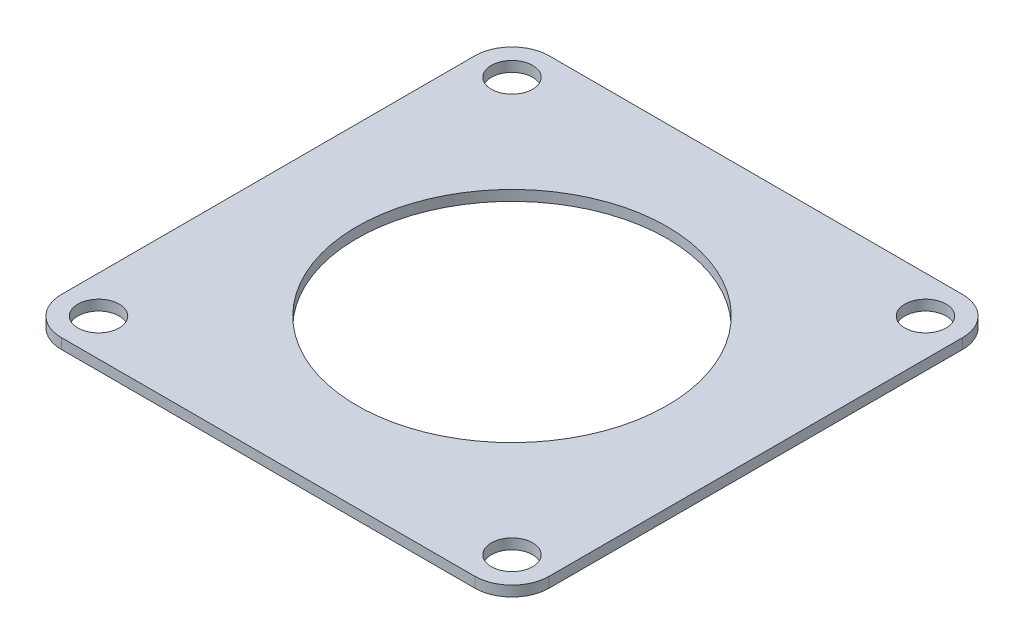
ISO-10303-21;
HEADER;
FILE_DESCRIPTION(('STEP AP214'),'2;1');
FILE_NAME('part.step','',(''),(''),'','','');
FILE_SCHEMA(('AUTOMOTIVE_DESIGN { 1 0 10303 214 1 1 1 1 }'));
ENDSEC;
DATA;
#1=APPLICATION_CONTEXT('core data for automotive mechanical design processes');
#2=APPLICATION_PROTOCOL_DEFINITION('international standard','automotive_design',2000,#1);
#3=PRODUCT_CONTEXT('',#1,'mechanical');
#4=PRODUCT('Part','Part','',(#3));
#5=PRODUCT_RELATED_PRODUCT_CATEGORY('part','',(#4));
#6=PRODUCT_DEFINITION_FORMATION('','',#4);
#7=PRODUCT_DEFINITION_CONTEXT('part definition',#1,'design');
#8=PRODUCT_DEFINITION('design','',#6,#7);
#9=PRODUCT_DEFINITION_SHAPE('','',#8);
#10=(LENGTH_UNIT() NAMED_UNIT(*) SI_UNIT(.MILLI.,.METRE.));
#11=(NAMED_UNIT(*) PLANE_ANGLE_UNIT() SI_UNIT($,.RADIAN.));
#12=(NAMED_UNIT(*) SI_UNIT($,.STERADIAN.) SOLID_ANGLE_UNIT());
#13=UNCERTAINTY_MEASURE_WITH_UNIT(LENGTH_MEASURE(1.E-05),#10,'distance_accuracy_value','');
#14=(GEOMETRIC_REPRESENTATION_CONTEXT(3) GLOBAL_UNCERTAINTY_ASSIGNED_CONTEXT((#13)) GLOBAL_UNIT_ASSIGNED_CONTEXT((#10,
#11,#12)) REPRESENTATION_CONTEXT('',''));
#15=CARTESIAN_POINT('',(0.,0.,0.));
#16=DIRECTION('',(0.,0.,1.));
#17=DIRECTION('',(1.,0.,0.));
#18=AXIS2_PLACEMENT_3D('',#15,#16,#17);
#19=CARTESIAN_POINT('',(-99.9999999999941,5.,-99.9999999999964));
#20=DIRECTION('',(0.,1.,0.));
#21=DIRECTION('',(0.,0.,1.));
#22=AXIS2_PLACEMENT_3D('',#19,#20,#21);
#23=PLANE('',#22);
#24=CARTESIAN_POINT('',(0.,5.,0.));
#25=DIRECTION('',(0.,-1.,0.));
#26=DIRECTION('',(0.,0.,-1.));
#27=AXIS2_PLACEMENT_3D('',#24,#25,#26);
#28=CIRCLE('',#27,75.);
#29=CARTESIAN_POINT('',(0.,5.,-75.));
#30=VERTEX_POINT('',#29);
#31=EDGE_CURVE('E200',#30,#30,#28,.T.);
#32=ORIENTED_EDGE('',*,*,#31,.T.);
#33=EDGE_LOOP('',(#32));
#34=FACE_BOUND('',#33,.T.);
#35=CARTESIAN_POINT('',(-99.9999999999905,5.,99.9999999999976));
#36=DIRECTION('',(0.,1.,0.));
#37=DIRECTION('',(0.,0.,1.));
#38=AXIS2_PLACEMENT_3D('',#35,#36,#37);
#39=CIRCLE('',#38,10.0000000000102);
#40=CARTESIAN_POINT('',(-99.9999999999905,5.,110.000000000008));
#41=VERTEX_POINT('',#40);
#42=EDGE_CURVE('E188',#41,#41,#39,.T.);
#43=ORIENTED_EDGE('',*,*,#42,.F.);
#44=EDGE_LOOP('',(#43));
#45=FACE_BOUND('',#44,.T.);
#46=CARTESIAN_POINT('',(100.,5.,-100.));
#47=DIRECTION('',(0.,1.,0.));
#48=DIRECTION('',(0.,0.,1.));
#49=AXIS2_PLACEMENT_3D('',#46,#47,#48);
#50=CIRCLE('',#49,9.99999999999999);
#51=CARTESIAN_POINT('',(100.,5.,-90.));
#52=VERTEX_POINT('',#51);
#53=EDGE_CURVE('E134',#52,#52,#50,.T.);
#54=ORIENTED_EDGE('',*,*,#53,.F.);
#55=EDGE_LOOP('',(#54));
#56=FACE_BOUND('',#55,.T.);
#57=CARTESIAN_POINT('',(-99.9999999999941,5.,-99.9999999999964));
#58=DIRECTION('',(0.,1.,0.));
#59=DIRECTION('',(0.,0.,1.));
#60=AXIS2_PLACEMENT_3D('',#57,#58,#59);
#61=CIRCLE('',#60,18.);
#62=CARTESIAN_POINT('',(-99.9999999999941,5.,-117.999999999996));
#63=VERTEX_POINT('',#62);
#64=CARTESIAN_POINT('',(-117.999999999994,5.,-99.9999999999964));
#65=VERTEX_POINT('',#64);
#66=EDGE_CURVE('E145',#63,#65,#61,.T.);
#67=ORIENTED_EDGE('',*,*,#66,.T.);
#68=DIRECTION('',(0.,0.,1.));
#69=VECTOR('',#68,1.);
#70=CARTESIAN_POINT('',(-117.999999999994,5.,99.9999999999983));
#71=LINE('',#70,#69);
#72=CARTESIAN_POINT('',(-117.999999999994,5.,99.9999999999983));
#73=VERTEX_POINT('',#72);
#74=EDGE_CURVE('E93',#65,#73,#71,.T.);
#75=ORIENTED_EDGE('',*,*,#74,.T.);
#76=CARTESIAN_POINT('',(-99.999999999994,5.,99.9999999999983));
#77=DIRECTION('',(0.,1.,0.));
#78=DIRECTION('',(0.,0.,1.));
#79=AXIS2_PLACEMENT_3D('',#76,#77,#78);
#80=CIRCLE('',#79,18.);
#81=CARTESIAN_POINT('',(-99.9999999999941,5.,117.999999999998));
#82=VERTEX_POINT('',#81);
#83=EDGE_CURVE('E160',#73,#82,#80,.T.);
#84=ORIENTED_EDGE('',*,*,#83,.T.);
#85=DIRECTION('',(1.,0.,0.));
#86=VECTOR('',#85,1.);
#87=CARTESIAN_POINT('',(100.000000000001,5.,117.999999999998));
#88=LINE('',#87,#86);
#89=CARTESIAN_POINT('',(100.000000000001,5.,117.999999999998));
#90=VERTEX_POINT('',#89);
#91=EDGE_CURVE('E173',#82,#90,#88,.T.);
#92=ORIENTED_EDGE('',*,*,#91,.T.);
#93=CARTESIAN_POINT('',(100.000000000001,5.,99.9999999999983));
#94=DIRECTION('',(0.,1.,0.));
#95=DIRECTION('',(0.,0.,1.));
#96=AXIS2_PLACEMENT_3D('',#93,#94,#95);
#97=CIRCLE('',#96,18.);
#98=CARTESIAN_POINT('',(118.000000000001,5.,99.9999999999983));
#99=VERTEX_POINT('',#98);
#100=EDGE_CURVE('E112',#90,#99,#97,.T.);
#101=ORIENTED_EDGE('',*,*,#100,.T.);
#102=DIRECTION('',(0.,0.,-1.));
#103=VECTOR('',#102,1.);
#104=CARTESIAN_POINT('',(118.000000000001,5.,-99.9999999999964));
#105=LINE('',#104,#103);
#106=CARTESIAN_POINT('',(118.000000000001,5.,-99.9999999999964));
#107=VERTEX_POINT('',#106);
#108=EDGE_CURVE('E106',#99,#107,#105,.T.);
#109=ORIENTED_EDGE('',*,*,#108,.T.);
#110=CARTESIAN_POINT('',(100.000000000001,5.,-99.9999999999964));
#111=DIRECTION('',(0.,1.,0.));
#112=DIRECTION('',(0.,0.,1.));
#113=AXIS2_PLACEMENT_3D('',#110,#111,#112);
#114=CIRCLE('',#113,18.);
#115=CARTESIAN_POINT('',(100.000000000001,5.,-117.999999999996));
#116=VERTEX_POINT('',#115);
#117=EDGE_CURVE('E110',#107,#116,#114,.T.);
#118=ORIENTED_EDGE('',*,*,#117,.T.);
#119=DIRECTION('',(-1.,0.,0.));
#120=VECTOR('',#119,1.);
#121=CARTESIAN_POINT('',(-99.9999999999941,5.,-117.999999999996));
#122=LINE('',#121,#120);
#123=EDGE_CURVE('E50',#116,#63,#122,.T.);
#124=ORIENTED_EDGE('',*,*,#123,.T.);
#125=EDGE_LOOP('',(#67,#75,#84,#92,#101,#109,#118,#124));
#126=FACE_BOUND('',#125,.T.);
#127=CARTESIAN_POINT('',(100.000000000004,5.,99.999999999994));
#128=DIRECTION('',(0.,1.,0.));
#129=DIRECTION('',(0.,0.,1.));
#130=AXIS2_PLACEMENT_3D('',#127,#128,#129);
#131=CIRCLE('',#130,10.0000000000049);
#132=CARTESIAN_POINT('',(100.000000000004,5.,109.999999999999));
#133=VERTEX_POINT('',#132);
#134=EDGE_CURVE('E182',#133,#133,#131,.T.);
#135=ORIENTED_EDGE('',*,*,#134,.F.);
#136=EDGE_LOOP('',(#135));
#137=FACE_BOUND('',#136,.T.);
#138=CARTESIAN_POINT('',(-99.9999999999941,5.,-99.9999999999964));
#139=DIRECTION('',(0.,1.,0.));
#140=DIRECTION('',(0.,0.,1.));
#141=AXIS2_PLACEMENT_3D('',#138,#139,#140);
#142=CIRCLE('',#141,10.0000000000058);
#143=CARTESIAN_POINT('',(-99.9999999999941,5.,-89.9999999999906));
#144=VERTEX_POINT('',#143);
#145=EDGE_CURVE('E194',#144,#144,#142,.T.);
#146=ORIENTED_EDGE('',*,*,#145,.F.);
#147=EDGE_LOOP('',(#146));
#148=FACE_BOUND('',#147,.T.);
#149=ADVANCED_FACE('F33',(#34,#45,#56,#126,#137,#148),#23,.T.);
#150=CARTESIAN_POINT('',(-99.9999999999941,0.,-99.9999999999964));
#151=DIRECTION('',(0.,1.,0.));
#152=DIRECTION('',(0.,0.,1.));
#153=AXIS2_PLACEMENT_3D('',#150,#151,#152);
#154=PLANE('',#153);
#155=CARTESIAN_POINT('',(0.,0.,0.));
#156=DIRECTION('',(0.,-1.,0.));
#157=DIRECTION('',(0.,0.,-1.));
#158=AXIS2_PLACEMENT_3D('',#155,#156,#157);
#159=CIRCLE('',#158,75.);
#160=CARTESIAN_POINT('',(0.,0.,-75.));
#161=VERTEX_POINT('',#160);
#162=EDGE_CURVE('E203',#161,#161,#159,.T.);
#163=ORIENTED_EDGE('',*,*,#162,.F.);
#164=EDGE_LOOP('',(#163));
#165=FACE_BOUND('',#164,.T.);
#166=CARTESIAN_POINT('',(-99.9999999999941,0.,-99.9999999999964));
#167=DIRECTION('',(0.,1.,0.));
#168=DIRECTION('',(0.,0.,1.));
#169=AXIS2_PLACEMENT_3D('',#166,#167,#168);
#170=CIRCLE('',#169,18.);
#171=CARTESIAN_POINT('',(-99.9999999999941,0.,-117.999999999996));
#172=VERTEX_POINT('',#171);
#173=CARTESIAN_POINT('',(-117.999999999994,0.,-99.9999999999964));
#174=VERTEX_POINT('',#173);
#175=EDGE_CURVE('E130',#172,#174,#170,.T.);
#176=ORIENTED_EDGE('',*,*,#175,.F.);
#177=DIRECTION('',(-1.,0.,0.));
#178=VECTOR('',#177,1.);
#179=CARTESIAN_POINT('',(-99.9999999999941,0.,-117.999999999996));
#180=LINE('',#179,#178);
#181=CARTESIAN_POINT('',(100.000000000001,0.,-117.999999999996));
#182=VERTEX_POINT('',#181);
#183=EDGE_CURVE('E85',#182,#172,#180,.T.);
#184=ORIENTED_EDGE('',*,*,#183,.F.);
#185=CARTESIAN_POINT('',(100.000000000001,0.,-99.9999999999964));
#186=DIRECTION('',(0.,1.,0.));
#187=DIRECTION('',(0.,0.,1.));
#188=AXIS2_PLACEMENT_3D('',#185,#186,#187);
#189=CIRCLE('',#188,18.);
#190=CARTESIAN_POINT('',(118.000000000001,0.,-99.9999999999964));
#191=VERTEX_POINT('',#190);
#192=EDGE_CURVE('E79',#191,#182,#189,.T.);
#193=ORIENTED_EDGE('',*,*,#192,.F.);
#194=DIRECTION('',(0.,0.,-1.));
#195=VECTOR('',#194,1.);
#196=CARTESIAN_POINT('',(118.000000000001,0.,-99.9999999999964));
#197=LINE('',#196,#195);
#198=CARTESIAN_POINT('',(118.000000000001,0.,99.9999999999983));
#199=VERTEX_POINT('',#198);
#200=EDGE_CURVE('E120',#199,#191,#197,.T.);
#201=ORIENTED_EDGE('',*,*,#200,.F.);
#202=CARTESIAN_POINT('',(100.000000000001,0.,99.9999999999983));
#203=DIRECTION('',(0.,1.,0.));
#204=DIRECTION('',(0.,0.,1.));
#205=AXIS2_PLACEMENT_3D('',#202,#203,#204);
#206=CIRCLE('',#205,18.);
#207=CARTESIAN_POINT('',(100.000000000001,0.,117.999999999998));
#208=VERTEX_POINT('',#207);
#209=EDGE_CURVE('E140',#208,#199,#206,.T.);
#210=ORIENTED_EDGE('',*,*,#209,.F.);
#211=DIRECTION('',(1.,0.,0.));
#212=VECTOR('',#211,1.);
#213=CARTESIAN_POINT('',(100.000000000001,0.,117.999999999998));
#214=LINE('',#213,#212);
#215=CARTESIAN_POINT('',(-99.9999999999941,0.,117.999999999998));
#216=VERTEX_POINT('',#215);
#217=EDGE_CURVE('E138',#216,#208,#214,.T.);
#218=ORIENTED_EDGE('',*,*,#217,.F.);
#219=CARTESIAN_POINT('',(-99.999999999994,0.,99.9999999999983));
#220=DIRECTION('',(0.,1.,0.));
#221=DIRECTION('',(0.,0.,1.));
#222=AXIS2_PLACEMENT_3D('',#219,#220,#221);
#223=CIRCLE('',#222,18.);
#224=CARTESIAN_POINT('',(-117.999999999994,0.,99.9999999999983));
#225=VERTEX_POINT('',#224);
#226=EDGE_CURVE('E136',#225,#216,#223,.T.);
#227=ORIENTED_EDGE('',*,*,#226,.F.);
#228=DIRECTION('',(0.,0.,1.));
#229=VECTOR('',#228,1.);
#230=CARTESIAN_POINT('',(-117.999999999994,0.,99.9999999999983));
#231=LINE('',#230,#229);
#232=EDGE_CURVE('E133',#174,#225,#231,.T.);
#233=ORIENTED_EDGE('',*,*,#232,.F.);
#234=EDGE_LOOP('',(#176,#184,#193,#201,#210,#218,#227,#233));
#235=FACE_BOUND('',#234,.T.);
#236=CARTESIAN_POINT('',(100.,0.,-100.));
#237=DIRECTION('',(0.,1.,0.));
#238=DIRECTION('',(0.,0.,1.));
#239=AXIS2_PLACEMENT_3D('',#236,#237,#238);
#240=CIRCLE('',#239,9.99999999999999);
#241=CARTESIAN_POINT('',(100.,0.,-90.));
#242=VERTEX_POINT('',#241);
#243=EDGE_CURVE('E179',#242,#242,#240,.T.);
#244=ORIENTED_EDGE('',*,*,#243,.T.);
#245=EDGE_LOOP('',(#244));
#246=FACE_BOUND('',#245,.T.);
#247=CARTESIAN_POINT('',(100.000000000004,0.,99.999999999994));
#248=DIRECTION('',(0.,1.,0.));
#249=DIRECTION('',(0.,0.,1.));
#250=AXIS2_PLACEMENT_3D('',#247,#248,#249);
#251=CIRCLE('',#250,10.0000000000049);
#252=CARTESIAN_POINT('',(100.000000000004,0.,109.999999999999));
#253=VERTEX_POINT('',#252);
#254=EDGE_CURVE('E185',#253,#253,#251,.T.);
#255=ORIENTED_EDGE('',*,*,#254,.T.);
#256=EDGE_LOOP('',(#255));
#257=FACE_BOUND('',#256,.T.);
#258=CARTESIAN_POINT('',(-99.9999999999905,0.,99.9999999999976));
#259=DIRECTION('',(0.,1.,0.));
#260=DIRECTION('',(0.,0.,1.));
#261=AXIS2_PLACEMENT_3D('',#258,#259,#260);
#262=CIRCLE('',#261,10.0000000000102);
#263=CARTESIAN_POINT('',(-99.9999999999905,0.,110.000000000008));
#264=VERTEX_POINT('',#263);
#265=EDGE_CURVE('E191',#264,#264,#262,.T.);
#266=ORIENTED_EDGE('',*,*,#265,.T.);
#267=EDGE_LOOP('',(#266));
#268=FACE_BOUND('',#267,.T.);
#269=CARTESIAN_POINT('',(-99.9999999999941,0.,-99.9999999999964));
#270=DIRECTION('',(0.,1.,0.));
#271=DIRECTION('',(0.,0.,1.));
#272=AXIS2_PLACEMENT_3D('',#269,#270,#271);
#273=CIRCLE('',#272,10.0000000000058);
#274=CARTESIAN_POINT('',(-99.9999999999941,0.,-89.9999999999906));
#275=VERTEX_POINT('',#274);
#276=EDGE_CURVE('E197',#275,#275,#273,.T.);
#277=ORIENTED_EDGE('',*,*,#276,.T.);
#278=EDGE_LOOP('',(#277));
#279=FACE_BOUND('',#278,.T.);
#280=ADVANCED_FACE('F164',(#165,#235,#246,#257,#268,#279),#154,.F.);
#281=CARTESIAN_POINT('',(-99.9999999999941,5.,-99.9999999999964));
#282=DIRECTION('',(0.,-1.,0.));
#283=DIRECTION('',(0.,0.,-1.));
#284=AXIS2_PLACEMENT_3D('',#281,#282,#283);
#285=CYLINDRICAL_SURFACE('',#284,18.);
#286=ORIENTED_EDGE('',*,*,#175,.T.);
#287=DIRECTION('',(0.,-1.,0.));
#288=VECTOR('',#287,1.);
#289=CARTESIAN_POINT('',(-117.999999999994,5.,-99.9999999999964));
#290=LINE('',#289,#288);
#291=EDGE_CURVE('E11',#65,#174,#290,.T.);
#292=ORIENTED_EDGE('',*,*,#291,.F.);
#293=ORIENTED_EDGE('',*,*,#66,.F.);
#294=DIRECTION('',(0.,-1.,0.));
#295=VECTOR('',#294,1.);
#296=CARTESIAN_POINT('',(-99.9999999999941,5.,-117.999999999996));
#297=LINE('',#296,#295);
#298=EDGE_CURVE('E126',#63,#172,#297,.T.);
#299=ORIENTED_EDGE('',*,*,#298,.T.);
#300=EDGE_LOOP('',(#286,#292,#293,#299));
#301=FACE_BOUND('',#300,.T.);
#302=ADVANCED_FACE('F35',(#301),#285,.T.);
#303=CARTESIAN_POINT('',(-117.999999999994,5.,99.9999999999983));
#304=DIRECTION('',(1.,0.,0.));
#305=DIRECTION('',(0.,0.,-1.));
#306=AXIS2_PLACEMENT_3D('',#303,#304,#305);
#307=PLANE('',#306);
#308=ORIENTED_EDGE('',*,*,#232,.T.);
#309=DIRECTION('',(0.,-1.,0.));
#310=VECTOR('',#309,1.);
#311=CARTESIAN_POINT('',(-117.999999999994,5.,99.9999999999983));
#312=LINE('',#311,#310);
#313=EDGE_CURVE('E42',#73,#225,#312,.T.);
#314=ORIENTED_EDGE('',*,*,#313,.F.);
#315=ORIENTED_EDGE('',*,*,#74,.F.);
#316=ORIENTED_EDGE('',*,*,#291,.T.);
#317=EDGE_LOOP('',(#308,#314,#315,#316));
#318=FACE_BOUND('',#317,.T.);
#319=ADVANCED_FACE('F225',(#318),#307,.F.);
#320=CARTESIAN_POINT('',(-99.999999999994,5.,99.9999999999983));
#321=DIRECTION('',(0.,-1.,0.));
#322=DIRECTION('',(0.,0.,-1.));
#323=AXIS2_PLACEMENT_3D('',#320,#321,#322);
#324=CYLINDRICAL_SURFACE('',#323,18.);
#325=ORIENTED_EDGE('',*,*,#226,.T.);
#326=DIRECTION('',(0.,-1.,0.));
#327=VECTOR('',#326,1.);
#328=CARTESIAN_POINT('',(-99.9999999999941,5.,117.999999999998));
#329=LINE('',#328,#327);
#330=EDGE_CURVE('E152',#82,#216,#329,.T.);
#331=ORIENTED_EDGE('',*,*,#330,.F.);
#332=ORIENTED_EDGE('',*,*,#83,.F.);
#333=ORIENTED_EDGE('',*,*,#313,.T.);
#334=EDGE_LOOP('',(#325,#331,#332,#333));
#335=FACE_BOUND('',#334,.T.);
#336=ADVANCED_FACE('F158',(#335),#324,.T.);
#337=CARTESIAN_POINT('',(100.000000000001,5.,117.999999999998));
#338=DIRECTION('',(0.,0.,-1.));
#339=DIRECTION('',(-1.,0.,0.));
#340=AXIS2_PLACEMENT_3D('',#337,#338,#339);
#341=PLANE('',#340);
#342=ORIENTED_EDGE('',*,*,#217,.T.);
#343=DIRECTION('',(0.,-1.,0.));
#344=VECTOR('',#343,1.);
#345=CARTESIAN_POINT('',(100.000000000001,5.,117.999999999998));
#346=LINE('',#345,#344);
#347=EDGE_CURVE('E149',#90,#208,#346,.T.);
#348=ORIENTED_EDGE('',*,*,#347,.F.);
#349=ORIENTED_EDGE('',*,*,#91,.F.);
#350=ORIENTED_EDGE('',*,*,#330,.T.);
#351=EDGE_LOOP('',(#342,#348,#349,#350));
#352=FACE_BOUND('',#351,.T.);
#353=ADVANCED_FACE('F169',(#352),#341,.F.);
#354=CARTESIAN_POINT('',(100.000000000001,5.,99.9999999999983));
#355=DIRECTION('',(0.,-1.,0.));
#356=DIRECTION('',(0.,0.,-1.));
#357=AXIS2_PLACEMENT_3D('',#354,#355,#356);
#358=CYLINDRICAL_SURFACE('',#357,18.);
#359=ORIENTED_EDGE('',*,*,#209,.T.);
#360=DIRECTION('',(0.,-1.,0.));
#361=VECTOR('',#360,1.);
#362=CARTESIAN_POINT('',(118.000000000001,5.,99.9999999999983));
#363=LINE('',#362,#361);
#364=EDGE_CURVE('E121',#99,#199,#363,.T.);
#365=ORIENTED_EDGE('',*,*,#364,.F.);
#366=ORIENTED_EDGE('',*,*,#100,.F.);
#367=ORIENTED_EDGE('',*,*,#347,.T.);
#368=EDGE_LOOP('',(#359,#365,#366,#367));
#369=FACE_BOUND('',#368,.T.);
#370=ADVANCED_FACE('F172',(#369),#358,.T.);
#371=CARTESIAN_POINT('',(118.000000000001,5.,-99.9999999999964));
#372=DIRECTION('',(-1.,0.,0.));
#373=DIRECTION('',(0.,0.,1.));
#374=AXIS2_PLACEMENT_3D('',#371,#372,#373);
#375=PLANE('',#374);
#376=ORIENTED_EDGE('',*,*,#200,.T.);
#377=DIRECTION('',(0.,-1.,0.));
#378=VECTOR('',#377,1.);
#379=CARTESIAN_POINT('',(118.000000000001,5.,-99.9999999999964));
#380=LINE('',#379,#378);
#381=EDGE_CURVE('E117',#107,#191,#380,.T.);
#382=ORIENTED_EDGE('',*,*,#381,.F.);
#383=ORIENTED_EDGE('',*,*,#108,.F.);
#384=ORIENTED_EDGE('',*,*,#364,.T.);
#385=EDGE_LOOP('',(#376,#382,#383,#384));
#386=FACE_BOUND('',#385,.T.);
#387=ADVANCED_FACE('F118',(#386),#375,.F.);
#388=CARTESIAN_POINT('',(100.000000000001,5.,-99.9999999999964));
#389=DIRECTION('',(0.,-1.,0.));
#390=DIRECTION('',(0.,0.,-1.));
#391=AXIS2_PLACEMENT_3D('',#388,#389,#390);
#392=CYLINDRICAL_SURFACE('',#391,18.);
#393=ORIENTED_EDGE('',*,*,#192,.T.);
#394=DIRECTION('',(0.,-1.,0.));
#395=VECTOR('',#394,1.);
#396=CARTESIAN_POINT('',(100.000000000001,5.,-117.999999999996));
#397=LINE('',#396,#395);
#398=EDGE_CURVE('E122',#116,#182,#397,.T.);
#399=ORIENTED_EDGE('',*,*,#398,.F.);
#400=ORIENTED_EDGE('',*,*,#117,.F.);
#401=ORIENTED_EDGE('',*,*,#381,.T.);
#402=EDGE_LOOP('',(#393,#399,#400,#401));
#403=FACE_BOUND('',#402,.T.);
#404=ADVANCED_FACE('F124',(#403),#392,.T.);
#405=CARTESIAN_POINT('',(-99.9999999999941,5.,-117.999999999996));
#406=DIRECTION('',(0.,0.,1.));
#407=DIRECTION('',(1.,0.,0.));
#408=AXIS2_PLACEMENT_3D('',#405,#406,#407);
#409=PLANE('',#408);
#410=ORIENTED_EDGE('',*,*,#183,.T.);
#411=ORIENTED_EDGE('',*,*,#298,.F.);
#412=ORIENTED_EDGE('',*,*,#123,.F.);
#413=ORIENTED_EDGE('',*,*,#398,.T.);
#414=EDGE_LOOP('',(#410,#411,#412,#413));
#415=FACE_BOUND('',#414,.T.);
#416=ADVANCED_FACE('F230',(#415),#409,.F.);
#417=CARTESIAN_POINT('',(100.,5.,-100.));
#418=DIRECTION('',(0.,-1.,0.));
#419=DIRECTION('',(0.,0.,-1.));
#420=AXIS2_PLACEMENT_3D('',#417,#418,#419);
#421=CYLINDRICAL_SURFACE('',#420,9.99999999999999);
#422=ORIENTED_EDGE('',*,*,#53,.T.);
#423=EDGE_LOOP('',(#422));
#424=FACE_BOUND('',#423,.T.);
#425=ORIENTED_EDGE('',*,*,#243,.F.);
#426=EDGE_LOOP('',(#425));
#427=FACE_BOUND('',#426,.T.);
#428=ADVANCED_FACE('F233',(#424,#427),#421,.F.);
#429=CARTESIAN_POINT('',(100.000000000004,5.,99.999999999994));
#430=DIRECTION('',(0.,-1.,0.));
#431=DIRECTION('',(0.,0.,-1.));
#432=AXIS2_PLACEMENT_3D('',#429,#430,#431);
#433=CYLINDRICAL_SURFACE('',#432,10.0000000000049);
#434=ORIENTED_EDGE('',*,*,#134,.T.);
#435=EDGE_LOOP('',(#434));
#436=FACE_BOUND('',#435,.T.);
#437=ORIENTED_EDGE('',*,*,#254,.F.);
#438=EDGE_LOOP('',(#437));
#439=FACE_BOUND('',#438,.T.);
#440=ADVANCED_FACE('F280',(#436,#439),#433,.F.);
#441=CARTESIAN_POINT('',(-99.9999999999905,5.,99.9999999999976));
#442=DIRECTION('',(0.,-1.,0.));
#443=DIRECTION('',(0.,0.,-1.));
#444=AXIS2_PLACEMENT_3D('',#441,#442,#443);
#445=CYLINDRICAL_SURFACE('',#444,10.0000000000102);
#446=ORIENTED_EDGE('',*,*,#42,.T.);
#447=EDGE_LOOP('',(#446));
#448=FACE_BOUND('',#447,.T.);
#449=ORIENTED_EDGE('',*,*,#265,.F.);
#450=EDGE_LOOP('',(#449));
#451=FACE_BOUND('',#450,.T.);
#452=ADVANCED_FACE('F287',(#448,#451),#445,.F.);
#453=CARTESIAN_POINT('',(-99.9999999999941,5.,-99.9999999999964));
#454=DIRECTION('',(0.,-1.,0.));
#455=DIRECTION('',(0.,0.,-1.));
#456=AXIS2_PLACEMENT_3D('',#453,#454,#455);
#457=CYLINDRICAL_SURFACE('',#456,10.0000000000058);
#458=ORIENTED_EDGE('',*,*,#145,.T.);
#459=EDGE_LOOP('',(#458));
#460=FACE_BOUND('',#459,.T.);
#461=ORIENTED_EDGE('',*,*,#276,.F.);
#462=EDGE_LOOP('',(#461));
#463=FACE_BOUND('',#462,.T.);
#464=ADVANCED_FACE('F214',(#460,#463),#457,.F.);
#465=CARTESIAN_POINT('',(0.,5.,0.));
#466=DIRECTION('',(0.,-1.,0.));
#467=DIRECTION('',(0.,0.,-1.));
#468=AXIS2_PLACEMENT_3D('',#465,#466,#467);
#469=CYLINDRICAL_SURFACE('',#468,75.);
#470=ORIENTED_EDGE('',*,*,#31,.F.);
#471=EDGE_LOOP('',(#470));
#472=FACE_BOUND('',#471,.T.);
#473=ORIENTED_EDGE('',*,*,#162,.T.);
#474=EDGE_LOOP('',(#473));
#475=FACE_BOUND('',#474,.T.);
#476=ADVANCED_FACE('F211',(#472,#475),#469,.F.);
#477=CLOSED_SHELL('',(#149,#280,#302,#319,#336,#353,#370,#387,#404,#416,#428,#440,#452,#464,#476));
#478=MANIFOLD_SOLID_BREP('B2',#477);
#479=ADVANCED_BREP_SHAPE_REPRESENTATION('',(#18,#478),#14);
#480=SHAPE_DEFINITION_REPRESENTATION(#9,#479);
ENDSEC;
END-ISO-10303-21;
